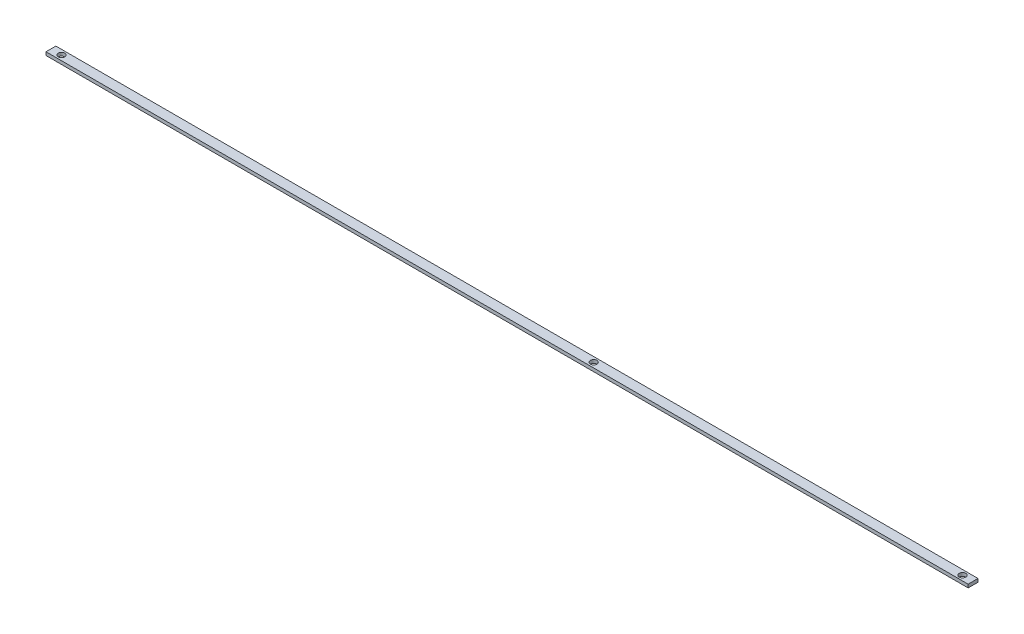
ISO-10303-21;
HEADER;
FILE_DESCRIPTION(('STEP AP214'),'2;1');
FILE_NAME('part.step','',(''),(''),'','','');
FILE_SCHEMA(('AUTOMOTIVE_DESIGN { 1 0 10303 214 1 1 1 1 }'));
ENDSEC;
DATA;
#1=APPLICATION_CONTEXT('core data for automotive mechanical design processes');
#2=APPLICATION_PROTOCOL_DEFINITION('international standard','automotive_design',2000,#1);
#3=PRODUCT_CONTEXT('',#1,'mechanical');
#4=PRODUCT('Part','Part','',(#3));
#5=PRODUCT_RELATED_PRODUCT_CATEGORY('part','',(#4));
#6=PRODUCT_DEFINITION_FORMATION('','',#4);
#7=PRODUCT_DEFINITION_CONTEXT('part definition',#1,'design');
#8=PRODUCT_DEFINITION('design','',#6,#7);
#9=PRODUCT_DEFINITION_SHAPE('','',#8);
#10=(LENGTH_UNIT() NAMED_UNIT(*) SI_UNIT(.MILLI.,.METRE.));
#11=(NAMED_UNIT(*) PLANE_ANGLE_UNIT() SI_UNIT($,.RADIAN.));
#12=(NAMED_UNIT(*) SI_UNIT($,.STERADIAN.) SOLID_ANGLE_UNIT());
#13=UNCERTAINTY_MEASURE_WITH_UNIT(LENGTH_MEASURE(1.E-05),#10,'distance_accuracy_value','');
#14=(GEOMETRIC_REPRESENTATION_CONTEXT(3) GLOBAL_UNCERTAINTY_ASSIGNED_CONTEXT((#13)) GLOBAL_UNIT_ASSIGNED_CONTEXT((#10,
#11,#12)) REPRESENTATION_CONTEXT('',''));
#15=CARTESIAN_POINT('',(0.,0.,0.));
#16=DIRECTION('',(0.,0.,1.));
#17=DIRECTION('',(1.,0.,0.));
#18=AXIS2_PLACEMENT_3D('',#15,#16,#17);
#19=CARTESIAN_POINT('',(844.466952655672,3.175,-9.52500000000011));
#20=DIRECTION('',(0.,0.,1.));
#21=DIRECTION('',(1.,0.,0.));
#22=AXIS2_PLACEMENT_3D('',#19,#20,#21);
#23=PLANE('',#22);
#24=DIRECTION('',(-1.,0.,0.));
#25=VECTOR('',#24,1.);
#26=CARTESIAN_POINT('',(844.466952655672,0.,-9.52500000000011));
#27=LINE('',#26,#25);
#28=CARTESIAN_POINT('',(844.466952655672,0.,-9.52500000000011));
#29=VERTEX_POINT('',#28);
#30=CARTESIAN_POINT('',(-44.5330473443281,0.,-9.525));
#31=VERTEX_POINT('',#30);
#32=EDGE_CURVE('E99',#29,#31,#27,.T.);
#33=ORIENTED_EDGE('',*,*,#32,.T.);
#34=DIRECTION('',(0.,-1.,0.));
#35=VECTOR('',#34,1.);
#36=CARTESIAN_POINT('',(-44.5330473443281,3.175,-9.525));
#37=LINE('',#36,#35);
#38=CARTESIAN_POINT('',(-44.5330473443281,3.175,-9.525));
#39=VERTEX_POINT('',#38);
#40=EDGE_CURVE('E11',#39,#31,#37,.T.);
#41=ORIENTED_EDGE('',*,*,#40,.F.);
#42=DIRECTION('',(-1.,0.,0.));
#43=VECTOR('',#42,1.);
#44=CARTESIAN_POINT('',(844.466952655672,3.175,-9.52500000000011));
#45=LINE('',#44,#43);
#46=CARTESIAN_POINT('',(844.466952655672,3.175,-9.52500000000011));
#47=VERTEX_POINT('',#46);
#48=EDGE_CURVE('E86',#47,#39,#45,.T.);
#49=ORIENTED_EDGE('',*,*,#48,.F.);
#50=DIRECTION('',(0.,-1.,0.));
#51=VECTOR('',#50,1.);
#52=CARTESIAN_POINT('',(844.466952655672,3.175,-9.52500000000011));
#53=LINE('',#52,#51);
#54=EDGE_CURVE('E95',#47,#29,#53,.T.);
#55=ORIENTED_EDGE('',*,*,#54,.T.);
#56=EDGE_LOOP('',(#33,#41,#49,#55));
#57=FACE_BOUND('',#56,.T.);
#58=ADVANCED_FACE('F33',(#57),#23,.F.);
#59=CARTESIAN_POINT('',(-44.5330473443281,3.175,-9.525));
#60=DIRECTION('',(1.,0.,0.));
#61=DIRECTION('',(0.,0.,-1.));
#62=AXIS2_PLACEMENT_3D('',#59,#60,#61);
#63=PLANE('',#62);
#64=DIRECTION('',(0.,0.,1.));
#65=VECTOR('',#64,1.);
#66=CARTESIAN_POINT('',(-44.5330473443281,0.,-9.525));
#67=LINE('',#66,#65);
#68=CARTESIAN_POINT('',(-44.5330473443281,0.,0.));
#69=VERTEX_POINT('',#68);
#70=EDGE_CURVE('E90',#31,#69,#67,.T.);
#71=ORIENTED_EDGE('',*,*,#70,.T.);
#72=DIRECTION('',(0.,-1.,0.));
#73=VECTOR('',#72,1.);
#74=CARTESIAN_POINT('',(-44.5330473443281,3.175,0.));
#75=LINE('',#74,#73);
#76=CARTESIAN_POINT('',(-44.5330473443281,3.175,0.));
#77=VERTEX_POINT('',#76);
#78=EDGE_CURVE('E42',#77,#69,#75,.T.);
#79=ORIENTED_EDGE('',*,*,#78,.F.);
#80=DIRECTION('',(0.,0.,1.));
#81=VECTOR('',#80,1.);
#82=CARTESIAN_POINT('',(-44.5330473443281,3.175,-9.525));
#83=LINE('',#82,#81);
#84=EDGE_CURVE('E81',#39,#77,#83,.T.);
#85=ORIENTED_EDGE('',*,*,#84,.F.);
#86=ORIENTED_EDGE('',*,*,#40,.T.);
#87=EDGE_LOOP('',(#71,#79,#85,#86));
#88=FACE_BOUND('',#87,.T.);
#89=ADVANCED_FACE('F89',(#88),#63,.F.);
#90=CARTESIAN_POINT('',(-44.5330473443281,3.175,0.));
#91=DIRECTION('',(0.,0.,-1.));
#92=DIRECTION('',(-1.,0.,0.));
#93=AXIS2_PLACEMENT_3D('',#90,#91,#92);
#94=PLANE('',#93);
#95=DIRECTION('',(1.,0.,0.));
#96=VECTOR('',#95,1.);
#97=CARTESIAN_POINT('',(-44.5330473443281,0.,0.));
#98=LINE('',#97,#96);
#99=CARTESIAN_POINT('',(844.466952655672,0.,0.));
#100=VERTEX_POINT('',#99);
#101=EDGE_CURVE('E68',#69,#100,#98,.T.);
#102=ORIENTED_EDGE('',*,*,#101,.T.);
#103=DIRECTION('',(0.,-1.,0.));
#104=VECTOR('',#103,1.);
#105=CARTESIAN_POINT('',(844.466952655672,3.175,0.));
#106=LINE('',#105,#104);
#107=CARTESIAN_POINT('',(844.466952655672,3.175,0.));
#108=VERTEX_POINT('',#107);
#109=EDGE_CURVE('E91',#108,#100,#106,.T.);
#110=ORIENTED_EDGE('',*,*,#109,.F.);
#111=DIRECTION('',(1.,0.,0.));
#112=VECTOR('',#111,1.);
#113=CARTESIAN_POINT('',(-44.5330473443281,3.175,0.));
#114=LINE('',#113,#112);
#115=EDGE_CURVE('E84',#77,#108,#114,.T.);
#116=ORIENTED_EDGE('',*,*,#115,.F.);
#117=ORIENTED_EDGE('',*,*,#78,.T.);
#118=EDGE_LOOP('',(#102,#110,#116,#117));
#119=FACE_BOUND('',#118,.T.);
#120=ADVANCED_FACE('F93',(#119),#94,.F.);
#121=CARTESIAN_POINT('',(844.466952655672,3.175,0.));
#122=DIRECTION('',(-1.,0.,0.));
#123=DIRECTION('',(0.,0.,1.));
#124=AXIS2_PLACEMENT_3D('',#121,#122,#123);
#125=PLANE('',#124);
#126=DIRECTION('',(0.,0.,-1.));
#127=VECTOR('',#126,1.);
#128=CARTESIAN_POINT('',(844.466952655672,0.,0.));
#129=LINE('',#128,#127);
#130=EDGE_CURVE('E74',#100,#29,#129,.T.);
#131=ORIENTED_EDGE('',*,*,#130,.T.);
#132=ORIENTED_EDGE('',*,*,#54,.F.);
#133=DIRECTION('',(0.,0.,-1.));
#134=VECTOR('',#133,1.);
#135=CARTESIAN_POINT('',(844.466952655672,3.175,0.));
#136=LINE('',#135,#134);
#137=EDGE_CURVE('E51',#108,#47,#136,.T.);
#138=ORIENTED_EDGE('',*,*,#137,.F.);
#139=ORIENTED_EDGE('',*,*,#109,.T.);
#140=EDGE_LOOP('',(#131,#132,#138,#139));
#141=FACE_BOUND('',#140,.T.);
#142=ADVANCED_FACE('F133',(#141),#125,.F.);
#143=CARTESIAN_POINT('',(0.,3.175,0.));
#144=DIRECTION('',(0.,1.,0.));
#145=DIRECTION('',(0.,0.,1.));
#146=AXIS2_PLACEMENT_3D('',#143,#144,#145);
#147=PLANE('',#146);
#148=CARTESIAN_POINT('',(478.706952655672,3.175,-4.76250000000013));
#149=DIRECTION('',(0.,1.,0.));
#150=DIRECTION('',(0.,0.,1.));
#151=AXIS2_PLACEMENT_3D('',#148,#149,#150);
#152=CIRCLE('',#151,3.17500000000009);
#153=CARTESIAN_POINT('',(478.706952655672,3.175,-1.58750000000004));
#154=VERTEX_POINT('',#153);
#155=EDGE_CURVE('E122',#154,#154,#152,.T.);
#156=ORIENTED_EDGE('',*,*,#155,.F.);
#157=EDGE_LOOP('',(#156));
#158=FACE_BOUND('',#157,.T.);
#159=CARTESIAN_POINT('',(834.306952655672,3.175,-4.76250000000011));
#160=DIRECTION('',(0.,1.,0.));
#161=DIRECTION('',(0.,0.,1.));
#162=AXIS2_PLACEMENT_3D('',#159,#160,#161);
#163=CIRCLE('',#162,3.17500000000008);
#164=CARTESIAN_POINT('',(834.306952655672,3.175,-1.58750000000003));
#165=VERTEX_POINT('',#164);
#166=EDGE_CURVE('E112',#165,#165,#163,.T.);
#167=ORIENTED_EDGE('',*,*,#166,.F.);
#168=EDGE_LOOP('',(#167));
#169=FACE_BOUND('',#168,.T.);
#170=CARTESIAN_POINT('',(-34.3730473443281,3.175,-4.7625));
#171=DIRECTION('',(0.,1.,0.));
#172=DIRECTION('',(0.,0.,1.));
#173=AXIS2_PLACEMENT_3D('',#170,#171,#172);
#174=CIRCLE('',#173,3.175);
#175=CARTESIAN_POINT('',(-34.3730473443281,3.175,-1.5875));
#176=VERTEX_POINT('',#175);
#177=EDGE_CURVE('E109',#176,#176,#174,.T.);
#178=ORIENTED_EDGE('',*,*,#177,.F.);
#179=EDGE_LOOP('',(#178));
#180=FACE_BOUND('',#179,.T.);
#181=ORIENTED_EDGE('',*,*,#48,.T.);
#182=ORIENTED_EDGE('',*,*,#84,.T.);
#183=ORIENTED_EDGE('',*,*,#115,.T.);
#184=ORIENTED_EDGE('',*,*,#137,.T.);
#185=EDGE_LOOP('',(#181,#182,#183,#184));
#186=FACE_BOUND('',#185,.T.);
#187=ADVANCED_FACE('F82',(#158,#169,#180,#186),#147,.T.);
#188=CARTESIAN_POINT('',(0.,0.,0.));
#189=DIRECTION('',(0.,1.,0.));
#190=DIRECTION('',(0.,0.,1.));
#191=AXIS2_PLACEMENT_3D('',#188,#189,#190);
#192=PLANE('',#191);
#193=CARTESIAN_POINT('',(478.706952655672,0.,-4.76250000000013));
#194=DIRECTION('',(0.,1.,0.));
#195=DIRECTION('',(0.,0.,1.));
#196=AXIS2_PLACEMENT_3D('',#193,#194,#195);
#197=CIRCLE('',#196,3.17500000000009);
#198=CARTESIAN_POINT('',(478.706952655672,0.,-1.58750000000004));
#199=VERTEX_POINT('',#198);
#200=EDGE_CURVE('E36',#199,#199,#197,.T.);
#201=ORIENTED_EDGE('',*,*,#200,.T.);
#202=EDGE_LOOP('',(#201));
#203=FACE_BOUND('',#202,.T.);
#204=CARTESIAN_POINT('',(834.306952655672,0.,-4.76250000000011));
#205=DIRECTION('',(0.,1.,0.));
#206=DIRECTION('',(0.,0.,1.));
#207=AXIS2_PLACEMENT_3D('',#204,#205,#206);
#208=CIRCLE('',#207,3.17500000000008);
#209=CARTESIAN_POINT('',(834.306952655672,0.,-1.58750000000003));
#210=VERTEX_POINT('',#209);
#211=EDGE_CURVE('E110',#210,#210,#208,.T.);
#212=ORIENTED_EDGE('',*,*,#211,.T.);
#213=EDGE_LOOP('',(#212));
#214=FACE_BOUND('',#213,.T.);
#215=CARTESIAN_POINT('',(-34.3730473443281,0.,-4.7625));
#216=DIRECTION('',(0.,1.,0.));
#217=DIRECTION('',(0.,0.,1.));
#218=AXIS2_PLACEMENT_3D('',#215,#216,#217);
#219=CIRCLE('',#218,3.175);
#220=CARTESIAN_POINT('',(-34.3730473443281,0.,-1.5875));
#221=VERTEX_POINT('',#220);
#222=EDGE_CURVE('E102',#221,#221,#219,.T.);
#223=ORIENTED_EDGE('',*,*,#222,.T.);
#224=EDGE_LOOP('',(#223));
#225=FACE_BOUND('',#224,.T.);
#226=ORIENTED_EDGE('',*,*,#32,.F.);
#227=ORIENTED_EDGE('',*,*,#130,.F.);
#228=ORIENTED_EDGE('',*,*,#101,.F.);
#229=ORIENTED_EDGE('',*,*,#70,.F.);
#230=EDGE_LOOP('',(#226,#227,#228,#229));
#231=FACE_BOUND('',#230,.T.);
#232=ADVANCED_FACE('F132',(#203,#214,#225,#231),#192,.F.);
#233=CARTESIAN_POINT('',(-34.3730473443281,-3.175,-4.7625));
#234=DIRECTION('',(0.,1.,0.));
#235=DIRECTION('',(0.,0.,1.));
#236=AXIS2_PLACEMENT_3D('',#233,#234,#235);
#237=CYLINDRICAL_SURFACE('',#236,3.175);
#238=ORIENTED_EDGE('',*,*,#177,.T.);
#239=EDGE_LOOP('',(#238));
#240=FACE_BOUND('',#239,.T.);
#241=ORIENTED_EDGE('',*,*,#222,.F.);
#242=EDGE_LOOP('',(#241));
#243=FACE_BOUND('',#242,.T.);
#244=ADVANCED_FACE('F138',(#240,#243),#237,.F.);
#245=CARTESIAN_POINT('',(834.306952655672,-3.175,-4.76250000000011));
#246=DIRECTION('',(0.,1.,0.));
#247=DIRECTION('',(0.,0.,1.));
#248=AXIS2_PLACEMENT_3D('',#245,#246,#247);
#249=CYLINDRICAL_SURFACE('',#248,3.17500000000008);
#250=ORIENTED_EDGE('',*,*,#166,.T.);
#251=EDGE_LOOP('',(#250));
#252=FACE_BOUND('',#251,.T.);
#253=ORIENTED_EDGE('',*,*,#211,.F.);
#254=EDGE_LOOP('',(#253));
#255=FACE_BOUND('',#254,.T.);
#256=ADVANCED_FACE('F141',(#252,#255),#249,.F.);
#257=CARTESIAN_POINT('',(478.706952655672,-3.175,-4.76250000000013));
#258=DIRECTION('',(0.,1.,0.));
#259=DIRECTION('',(0.,0.,1.));
#260=AXIS2_PLACEMENT_3D('',#257,#258,#259);
#261=CYLINDRICAL_SURFACE('',#260,3.17500000000009);
#262=ORIENTED_EDGE('',*,*,#155,.T.);
#263=EDGE_LOOP('',(#262));
#264=FACE_BOUND('',#263,.T.);
#265=ORIENTED_EDGE('',*,*,#200,.F.);
#266=EDGE_LOOP('',(#265));
#267=FACE_BOUND('',#266,.T.);
#268=ADVANCED_FACE('F127',(#264,#267),#261,.F.);
#269=CLOSED_SHELL('',(#58,#89,#120,#142,#187,#232,#244,#256,#268));
#270=MANIFOLD_SOLID_BREP('B2',#269);
#271=ADVANCED_BREP_SHAPE_REPRESENTATION('',(#18,#270),#14);
#272=SHAPE_DEFINITION_REPRESENTATION(#9,#271);
ENDSEC;
END-ISO-10303-21;
